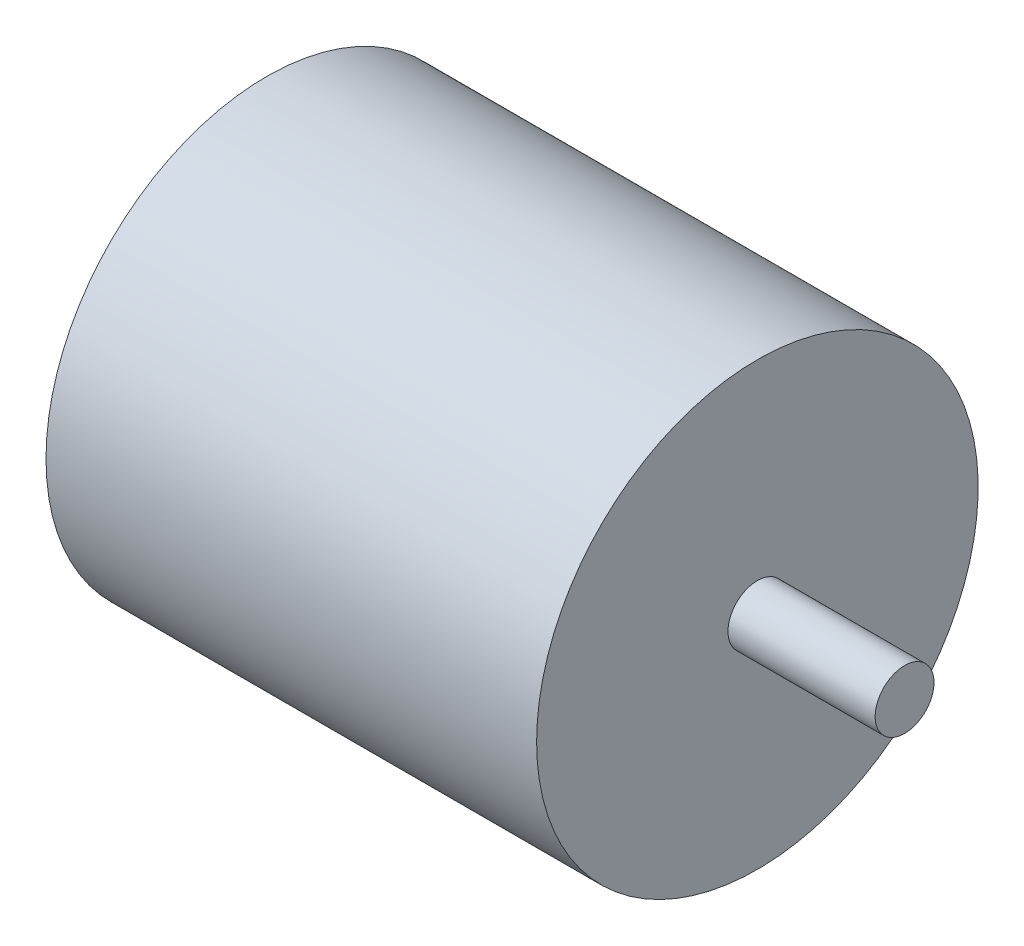
ISO-10303-21;
HEADER;
FILE_DESCRIPTION(('STEP AP214'),'2;1');
FILE_NAME('part.step','',(''),(''),'','','');
FILE_SCHEMA(('AUTOMOTIVE_DESIGN { 1 0 10303 214 1 1 1 1 }'));
ENDSEC;
DATA;
#1=APPLICATION_CONTEXT('core data for automotive mechanical design processes');
#2=APPLICATION_PROTOCOL_DEFINITION('international standard','automotive_design',2000,#1);
#3=PRODUCT_CONTEXT('',#1,'mechanical');
#4=PRODUCT('Part','Part','',(#3));
#5=PRODUCT_RELATED_PRODUCT_CATEGORY('part','',(#4));
#6=PRODUCT_DEFINITION_FORMATION('','',#4);
#7=PRODUCT_DEFINITION_CONTEXT('part definition',#1,'design');
#8=PRODUCT_DEFINITION('design','',#6,#7);
#9=PRODUCT_DEFINITION_SHAPE('','',#8);
#10=(LENGTH_UNIT() NAMED_UNIT(*) SI_UNIT(.MILLI.,.METRE.));
#11=(NAMED_UNIT(*) PLANE_ANGLE_UNIT() SI_UNIT($,.RADIAN.));
#12=(NAMED_UNIT(*) SI_UNIT($,.STERADIAN.) SOLID_ANGLE_UNIT());
#13=UNCERTAINTY_MEASURE_WITH_UNIT(LENGTH_MEASURE(1.E-05),#10,'distance_accuracy_value','');
#14=(GEOMETRIC_REPRESENTATION_CONTEXT(3) GLOBAL_UNCERTAINTY_ASSIGNED_CONTEXT((#13)) GLOBAL_UNIT_ASSIGNED_CONTEXT((#10,
#11,#12)) REPRESENTATION_CONTEXT('',''));
#15=CARTESIAN_POINT('',(0.,0.,0.));
#16=DIRECTION('',(0.,0.,1.));
#17=DIRECTION('',(1.,0.,0.));
#18=AXIS2_PLACEMENT_3D('',#15,#16,#17);
#19=CARTESIAN_POINT('',(15.,0.,0.));
#20=DIRECTION('',(-1.,0.,0.));
#21=DIRECTION('',(0.,0.,1.));
#22=AXIS2_PLACEMENT_3D('',#19,#20,#21);
#23=CYLINDRICAL_SURFACE('',#22,3.);
#24=CARTESIAN_POINT('',(15.,0.,0.));
#25=DIRECTION('',(1.,0.,0.));
#26=DIRECTION('',(0.,0.,-1.));
#27=AXIS2_PLACEMENT_3D('',#24,#25,#26);
#28=CIRCLE('',#27,3.);
#29=CARTESIAN_POINT('',(15.,0.,-3.));
#30=VERTEX_POINT('',#29);
#31=EDGE_CURVE('E10',#30,#30,#28,.T.);
#32=ORIENTED_EDGE('',*,*,#31,.F.);
#33=EDGE_LOOP('',(#32));
#34=FACE_BOUND('',#33,.T.);
#35=CARTESIAN_POINT('',(0.,0.,0.));
#36=DIRECTION('',(1.,0.,0.));
#37=DIRECTION('',(0.,0.,-1.));
#38=AXIS2_PLACEMENT_3D('',#35,#36,#37);
#39=CIRCLE('',#38,3.);
#40=CARTESIAN_POINT('',(0.,0.,-3.));
#41=VERTEX_POINT('',#40);
#42=EDGE_CURVE('E36',#41,#41,#39,.T.);
#43=ORIENTED_EDGE('',*,*,#42,.T.);
#44=EDGE_LOOP('',(#43));
#45=FACE_BOUND('',#44,.T.);
#46=ADVANCED_FACE('F33',(#34,#45),#23,.T.);
#47=CARTESIAN_POINT('',(15.,0.,0.));
#48=DIRECTION('',(1.,0.,0.));
#49=DIRECTION('',(0.,0.,-1.));
#50=AXIS2_PLACEMENT_3D('',#47,#48,#49);
#51=PLANE('',#50);
#52=ORIENTED_EDGE('',*,*,#31,.T.);
#53=EDGE_LOOP('',(#52));
#54=FACE_BOUND('',#53,.T.);
#55=ADVANCED_FACE('F56',(#54),#51,.T.);
#56=CARTESIAN_POINT('',(-50.,0.,0.));
#57=DIRECTION('',(1.,0.,0.));
#58=DIRECTION('',(0.,0.,-1.));
#59=AXIS2_PLACEMENT_3D('',#56,#57,#58);
#60=CYLINDRICAL_SURFACE('',#59,22.5);
#61=CARTESIAN_POINT('',(-50.,0.,0.));
#62=DIRECTION('',(-1.,0.,0.));
#63=DIRECTION('',(0.,0.,1.));
#64=AXIS2_PLACEMENT_3D('',#61,#62,#63);
#65=CIRCLE('',#64,22.5);
#66=CARTESIAN_POINT('',(-50.,0.,22.5));
#67=VERTEX_POINT('',#66);
#68=EDGE_CURVE('E43',#67,#67,#65,.T.);
#69=ORIENTED_EDGE('',*,*,#68,.F.);
#70=EDGE_LOOP('',(#69));
#71=FACE_BOUND('',#70,.T.);
#72=CARTESIAN_POINT('',(0.,0.,0.));
#73=DIRECTION('',(-1.,0.,0.));
#74=DIRECTION('',(0.,0.,1.));
#75=AXIS2_PLACEMENT_3D('',#72,#73,#74);
#76=CIRCLE('',#75,22.5);
#77=CARTESIAN_POINT('',(0.,0.,22.5));
#78=VERTEX_POINT('',#77);
#79=EDGE_CURVE('E45',#78,#78,#76,.T.);
#80=ORIENTED_EDGE('',*,*,#79,.T.);
#81=EDGE_LOOP('',(#80));
#82=FACE_BOUND('',#81,.T.);
#83=ADVANCED_FACE('F53',(#71,#82),#60,.T.);
#84=CARTESIAN_POINT('',(-50.,0.,0.));
#85=DIRECTION('',(-1.,0.,0.));
#86=DIRECTION('',(0.,0.,1.));
#87=AXIS2_PLACEMENT_3D('',#84,#85,#86);
#88=PLANE('',#87);
#89=ORIENTED_EDGE('',*,*,#68,.T.);
#90=EDGE_LOOP('',(#89));
#91=FACE_BOUND('',#90,.T.);
#92=ADVANCED_FACE('F51',(#91),#88,.T.);
#93=CARTESIAN_POINT('',(0.,0.,0.));
#94=DIRECTION('',(-1.,0.,0.));
#95=DIRECTION('',(0.,0.,1.));
#96=AXIS2_PLACEMENT_3D('',#93,#94,#95);
#97=PLANE('',#96);
#98=ORIENTED_EDGE('',*,*,#42,.F.);
#99=EDGE_LOOP('',(#98));
#100=FACE_BOUND('',#99,.T.);
#101=ORIENTED_EDGE('',*,*,#79,.F.);
#102=EDGE_LOOP('',(#101));
#103=FACE_BOUND('',#102,.T.);
#104=ADVANCED_FACE('F60',(#100,#103),#97,.F.);
#105=CLOSED_SHELL('',(#46,#55,#83,#92,#104));
#106=MANIFOLD_SOLID_BREP('B2',#105);
#107=ADVANCED_BREP_SHAPE_REPRESENTATION('',(#18,#106),#14);
#108=SHAPE_DEFINITION_REPRESENTATION(#9,#107);
ENDSEC;
END-ISO-10303-21;
